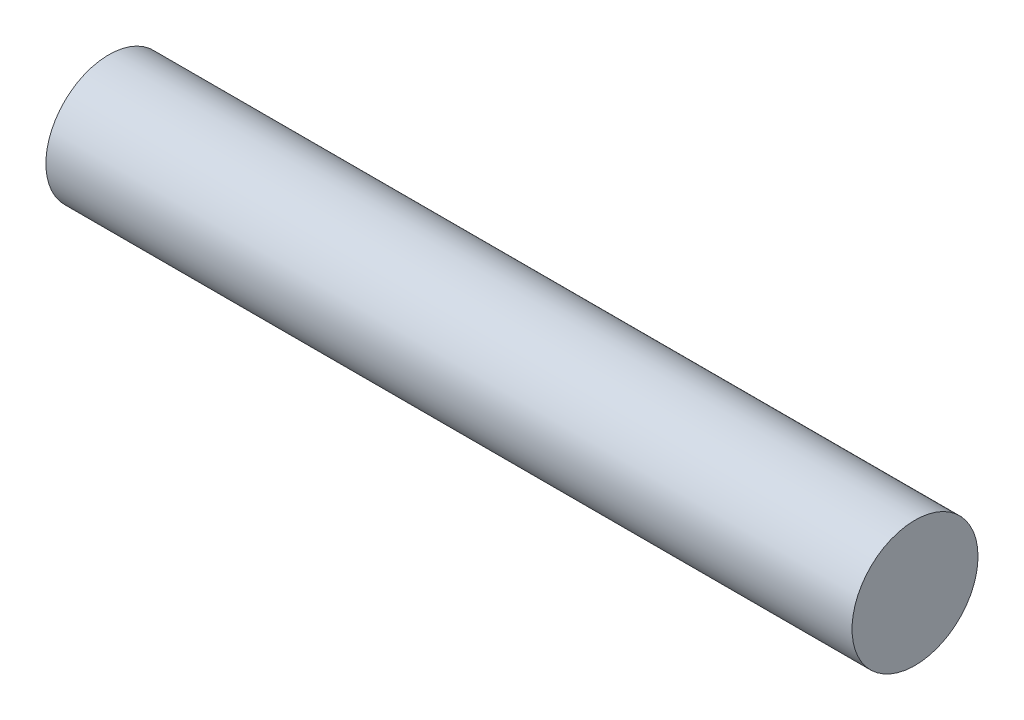
ISO-10303-21;
HEADER;
FILE_DESCRIPTION(('STEP AP214'),'2;1');
FILE_NAME('part.step','',(''),(''),'','','');
FILE_SCHEMA(('AUTOMOTIVE_DESIGN { 1 0 10303 214 1 1 1 1 }'));
ENDSEC;
DATA;
#1=APPLICATION_CONTEXT('core data for automotive mechanical design processes');
#2=APPLICATION_PROTOCOL_DEFINITION('international standard','automotive_design',2000,#1);
#3=PRODUCT_CONTEXT('',#1,'mechanical');
#4=PRODUCT('Part','Part','',(#3));
#5=PRODUCT_RELATED_PRODUCT_CATEGORY('part','',(#4));
#6=PRODUCT_DEFINITION_FORMATION('','',#4);
#7=PRODUCT_DEFINITION_CONTEXT('part definition',#1,'design');
#8=PRODUCT_DEFINITION('design','',#6,#7);
#9=PRODUCT_DEFINITION_SHAPE('','',#8);
#10=(LENGTH_UNIT() NAMED_UNIT(*) SI_UNIT(.MILLI.,.METRE.));
#11=(NAMED_UNIT(*) PLANE_ANGLE_UNIT() SI_UNIT($,.RADIAN.));
#12=(NAMED_UNIT(*) SI_UNIT($,.STERADIAN.) SOLID_ANGLE_UNIT());
#13=UNCERTAINTY_MEASURE_WITH_UNIT(LENGTH_MEASURE(1.E-05),#10,'distance_accuracy_value','');
#14=(GEOMETRIC_REPRESENTATION_CONTEXT(3) GLOBAL_UNCERTAINTY_ASSIGNED_CONTEXT((#13)) GLOBAL_UNIT_ASSIGNED_CONTEXT((#10,
#11,#12)) REPRESENTATION_CONTEXT('',''));
#15=CARTESIAN_POINT('',(0.,0.,0.));
#16=DIRECTION('',(0.,0.,1.));
#17=DIRECTION('',(1.,0.,0.));
#18=AXIS2_PLACEMENT_3D('',#15,#16,#17);
#19=CARTESIAN_POINT('',(203.2,0.,0.));
#20=DIRECTION('',(-1.,0.,0.));
#21=DIRECTION('',(0.,0.,1.));
#22=AXIS2_PLACEMENT_3D('',#19,#20,#21);
#23=CYLINDRICAL_SURFACE('',#22,15.875);
#24=CARTESIAN_POINT('',(203.2,0.,0.));
#25=DIRECTION('',(1.,0.,0.));
#26=DIRECTION('',(0.,0.,-1.));
#27=AXIS2_PLACEMENT_3D('',#24,#25,#26);
#28=CIRCLE('',#27,15.875);
#29=CARTESIAN_POINT('',(203.2,0.,-15.875));
#30=VERTEX_POINT('',#29);
#31=EDGE_CURVE('E10',#30,#30,#28,.T.);
#32=ORIENTED_EDGE('',*,*,#31,.F.);
#33=EDGE_LOOP('',(#32));
#34=FACE_BOUND('',#33,.T.);
#35=CARTESIAN_POINT('',(0.,0.,0.));
#36=DIRECTION('',(1.,0.,0.));
#37=DIRECTION('',(0.,0.,-1.));
#38=AXIS2_PLACEMENT_3D('',#35,#36,#37);
#39=CIRCLE('',#38,15.875);
#40=CARTESIAN_POINT('',(0.,0.,-15.875));
#41=VERTEX_POINT('',#40);
#42=EDGE_CURVE('E39',#41,#41,#39,.T.);
#43=ORIENTED_EDGE('',*,*,#42,.T.);
#44=EDGE_LOOP('',(#43));
#45=FACE_BOUND('',#44,.T.);
#46=ADVANCED_FACE('F36',(#34,#45),#23,.T.);
#47=CARTESIAN_POINT('',(203.2,0.,0.));
#48=DIRECTION('',(1.,0.,0.));
#49=DIRECTION('',(0.,0.,-1.));
#50=AXIS2_PLACEMENT_3D('',#47,#48,#49);
#51=PLANE('',#50);
#52=ORIENTED_EDGE('',*,*,#31,.T.);
#53=EDGE_LOOP('',(#52));
#54=FACE_BOUND('',#53,.T.);
#55=ADVANCED_FACE('F51',(#54),#51,.T.);
#56=CARTESIAN_POINT('',(0.,0.,0.));
#57=DIRECTION('',(1.,0.,0.));
#58=DIRECTION('',(0.,0.,-1.));
#59=AXIS2_PLACEMENT_3D('',#56,#57,#58);
#60=PLANE('',#59);
#61=ORIENTED_EDGE('',*,*,#42,.F.);
#62=EDGE_LOOP('',(#61));
#63=FACE_BOUND('',#62,.T.);
#64=ADVANCED_FACE('F49',(#63),#60,.F.);
#65=CLOSED_SHELL('',(#46,#55,#64));
#66=MANIFOLD_SOLID_BREP('B2',#65);
#67=ADVANCED_BREP_SHAPE_REPRESENTATION('',(#18,#66),#14);
#68=SHAPE_DEFINITION_REPRESENTATION(#9,#67);
ENDSEC;
END-ISO-10303-21;
